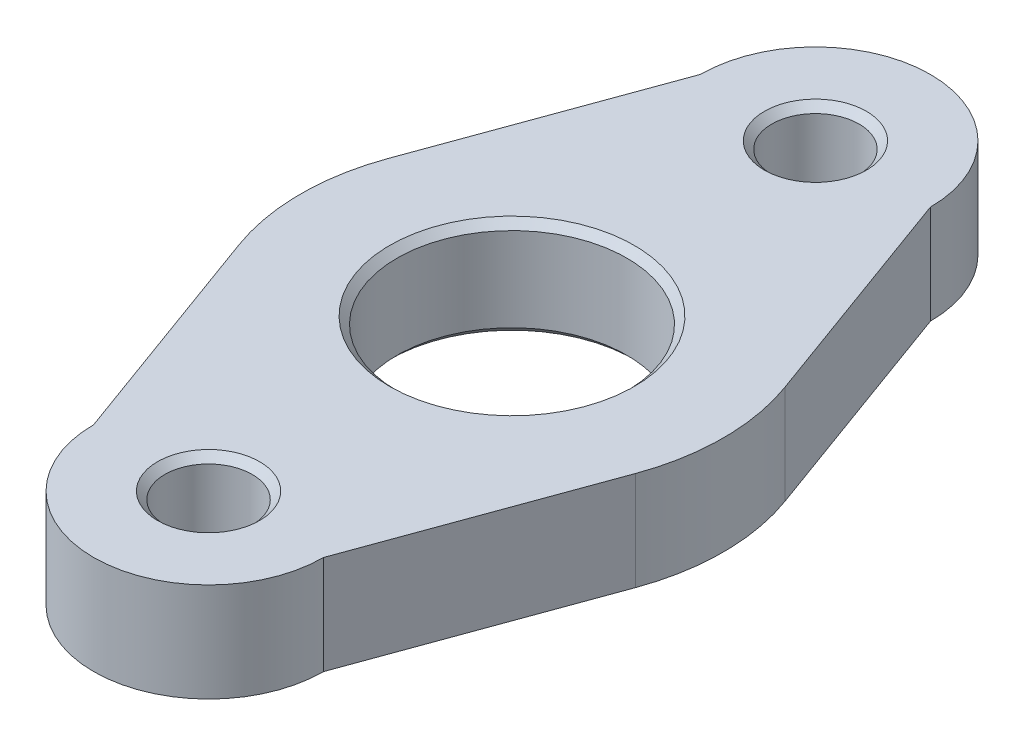
ISO-10303-21;
HEADER;
FILE_DESCRIPTION(('STEP AP214'),'2;1');
FILE_NAME('part.step','',(''),(''),'','','');
FILE_SCHEMA(('AUTOMOTIVE_DESIGN { 1 0 10303 214 1 1 1 1 }'));
ENDSEC;
DATA;
#1=APPLICATION_CONTEXT('core data for automotive mechanical design processes');
#2=APPLICATION_PROTOCOL_DEFINITION('international standard','automotive_design',2000,#1);
#3=PRODUCT_CONTEXT('',#1,'mechanical');
#4=PRODUCT('Part','Part','',(#3));
#5=PRODUCT_RELATED_PRODUCT_CATEGORY('part','',(#4));
#6=PRODUCT_DEFINITION_FORMATION('','',#4);
#7=PRODUCT_DEFINITION_CONTEXT('part definition',#1,'design');
#8=PRODUCT_DEFINITION('design','',#6,#7);
#9=PRODUCT_DEFINITION_SHAPE('','',#8);
#10=(LENGTH_UNIT() NAMED_UNIT(*) SI_UNIT(.MILLI.,.METRE.));
#11=(NAMED_UNIT(*) PLANE_ANGLE_UNIT() SI_UNIT($,.RADIAN.));
#12=(NAMED_UNIT(*) SI_UNIT($,.STERADIAN.) SOLID_ANGLE_UNIT());
#13=UNCERTAINTY_MEASURE_WITH_UNIT(LENGTH_MEASURE(1.E-05),#10,'distance_accuracy_value','');
#14=(GEOMETRIC_REPRESENTATION_CONTEXT(3) GLOBAL_UNCERTAINTY_ASSIGNED_CONTEXT((#13)) GLOBAL_UNIT_ASSIGNED_CONTEXT((#10,
#11,#12)) REPRESENTATION_CONTEXT('',''));
#15=CARTESIAN_POINT('',(0.,0.,0.));
#16=DIRECTION('',(0.,0.,1.));
#17=DIRECTION('',(1.,0.,0.));
#18=AXIS2_PLACEMENT_3D('',#15,#16,#17);
#19=CARTESIAN_POINT('',(95.885,80.772,-33.528));
#20=DIRECTION('',(0.,1.,0.));
#21=DIRECTION('',(0.,0.,1.));
#22=AXIS2_PLACEMENT_3D('',#19,#20,#21);
#23=PLANE('',#22);
#24=CARTESIAN_POINT('',(95.885,80.772,33.528));
#25=DIRECTION('',(0.,1.,0.));
#26=DIRECTION('',(0.,0.,1.));
#27=AXIS2_PLACEMENT_3D('',#24,#25,#26);
#28=CIRCLE('',#27,5.63879999999829);
#29=CARTESIAN_POINT('',(95.885,80.772,39.1667999999983));
#30=VERTEX_POINT('',#29);
#31=EDGE_CURVE('E188',#30,#30,#28,.F.);
#32=ORIENTED_EDGE('',*,*,#31,.T.);
#33=EDGE_LOOP('',(#32));
#34=FACE_BOUND('',#33,.T.);
#35=CARTESIAN_POINT('',(95.885,80.772,-33.528));
#36=DIRECTION('',(0.,1.,0.));
#37=DIRECTION('',(0.,0.,1.));
#38=AXIS2_PLACEMENT_3D('',#35,#36,#37);
#39=CIRCLE('',#38,5.6388);
#40=CARTESIAN_POINT('',(95.885,80.772,-27.8892));
#41=VERTEX_POINT('',#40);
#42=EDGE_CURVE('E185',#41,#41,#39,.F.);
#43=ORIENTED_EDGE('',*,*,#42,.T.);
#44=EDGE_LOOP('',(#43));
#45=FACE_BOUND('',#44,.T.);
#46=CARTESIAN_POINT('',(95.885,80.772,0.));
#47=DIRECTION('',(0.,1.,0.));
#48=DIRECTION('',(0.,0.,1.));
#49=AXIS2_PLACEMENT_3D('',#46,#47,#48);
#50=CIRCLE('',#49,13.5128);
#51=CARTESIAN_POINT('',(95.885,80.772,13.5128));
#52=VERTEX_POINT('',#51);
#53=EDGE_CURVE('E182',#52,#52,#50,.F.);
#54=ORIENTED_EDGE('',*,*,#53,.T.);
#55=EDGE_LOOP('',(#54));
#56=FACE_BOUND('',#55,.T.);
#57=CARTESIAN_POINT('',(95.885,80.772,-33.528));
#58=DIRECTION('',(0.,1.,0.));
#59=DIRECTION('',(0.,0.,1.));
#60=AXIS2_PLACEMENT_3D('',#57,#58,#59);
#61=CIRCLE('',#60,12.7);
#62=CARTESIAN_POINT('',(108.585,80.772,-33.528));
#63=VERTEX_POINT('',#62);
#64=CARTESIAN_POINT('',(83.185,80.772,-33.528));
#65=VERTEX_POINT('',#64);
#66=EDGE_CURVE('E152',#63,#65,#61,.T.);
#67=ORIENTED_EDGE('',*,*,#66,.T.);
#68=DIRECTION('',(-0.342020143325663,0.,0.93969262078591));
#69=VECTOR('',#68,1.);
#70=CARTESIAN_POINT('',(83.185,80.772,-33.528));
#71=LINE('',#70,#69);
#72=CARTESIAN_POINT('',(73.9856326958027,80.772,-8.25294605844833));
#73=VERTEX_POINT('',#72);
#74=EDGE_CURVE('E102',#65,#73,#71,.T.);
#75=ORIENTED_EDGE('',*,*,#74,.T.);
#76=CARTESIAN_POINT('',(96.6604156353667,80.772,0.));
#77=DIRECTION('',(0.,1.,0.));
#78=DIRECTION('',(0.,0.,1.));
#79=AXIS2_PLACEMENT_3D('',#76,#77,#78);
#80=CIRCLE('',#79,24.13);
#81=CARTESIAN_POINT('',(73.9856326958027,80.772,8.25294605844833));
#82=VERTEX_POINT('',#81);
#83=EDGE_CURVE('E292',#73,#82,#80,.T.);
#84=ORIENTED_EDGE('',*,*,#83,.T.);
#85=DIRECTION('',(0.34202014332569,0.,0.9396926207859));
#86=VECTOR('',#85,1.);
#87=CARTESIAN_POINT('',(73.9856326958027,80.772,8.25294605844832));
#88=LINE('',#87,#86);
#89=CARTESIAN_POINT('',(83.1850000000008,80.772,33.528));
#90=VERTEX_POINT('',#89);
#91=EDGE_CURVE('E296',#82,#90,#88,.T.);
#92=ORIENTED_EDGE('',*,*,#91,.T.);
#93=CARTESIAN_POINT('',(95.885,80.772,33.528));
#94=DIRECTION('',(0.,1.,0.));
#95=DIRECTION('',(0.,0.,1.));
#96=AXIS2_PLACEMENT_3D('',#93,#94,#95);
#97=CIRCLE('',#96,12.6999999999992);
#98=CARTESIAN_POINT('',(108.584999999999,80.772,33.528));
#99=VERTEX_POINT('',#98);
#100=EDGE_CURVE('E120',#90,#99,#97,.T.);
#101=ORIENTED_EDGE('',*,*,#100,.T.);
#102=DIRECTION('',(0.342020143325689,0.,-0.939692620785901));
#103=VECTOR('',#102,1.);
#104=CARTESIAN_POINT('',(108.584999999999,80.772,33.528));
#105=LINE('',#104,#103);
#106=CARTESIAN_POINT('',(117.784367304197,80.772,8.25294605844833));
#107=VERTEX_POINT('',#106);
#108=EDGE_CURVE('E115',#99,#107,#105,.T.);
#109=ORIENTED_EDGE('',*,*,#108,.T.);
#110=CARTESIAN_POINT('',(95.1095843646333,80.772,0.));
#111=DIRECTION('',(0.,1.,0.));
#112=DIRECTION('',(0.,0.,1.));
#113=AXIS2_PLACEMENT_3D('',#110,#111,#112);
#114=CIRCLE('',#113,24.13);
#115=CARTESIAN_POINT('',(117.784367304197,80.772,-8.25294605844832));
#116=VERTEX_POINT('',#115);
#117=EDGE_CURVE('E118',#107,#116,#114,.T.);
#118=ORIENTED_EDGE('',*,*,#117,.T.);
#119=DIRECTION('',(-0.342020143325662,0.,-0.939692620785911));
#120=VECTOR('',#119,1.);
#121=CARTESIAN_POINT('',(117.784367304197,80.772,-8.25294605844833));
#122=LINE('',#121,#120);
#123=EDGE_CURVE('E58',#116,#63,#122,.T.);
#124=ORIENTED_EDGE('',*,*,#123,.T.);
#125=EDGE_LOOP('',(#67,#75,#84,#92,#101,#109,#118,#124));
#126=FACE_BOUND('',#125,.T.);
#127=ADVANCED_FACE('F41',(#34,#45,#56,#126),#23,.T.);
#128=CARTESIAN_POINT('',(95.885,69.85,-33.528));
#129=DIRECTION('',(0.,1.,0.));
#130=DIRECTION('',(0.,0.,1.));
#131=AXIS2_PLACEMENT_3D('',#128,#129,#130);
#132=PLANE('',#131);
#133=CARTESIAN_POINT('',(95.885,69.85,33.528));
#134=DIRECTION('',(0.,1.,0.));
#135=DIRECTION('',(0.,0.,1.));
#136=AXIS2_PLACEMENT_3D('',#133,#134,#135);
#137=CIRCLE('',#136,5.63879999999829);
#138=CARTESIAN_POINT('',(95.885,69.85,39.1667999999983));
#139=VERTEX_POINT('',#138);
#140=EDGE_CURVE('E173',#139,#139,#137,.T.);
#141=ORIENTED_EDGE('',*,*,#140,.T.);
#142=EDGE_LOOP('',(#141));
#143=FACE_BOUND('',#142,.T.);
#144=CARTESIAN_POINT('',(95.885,69.85,-33.528));
#145=DIRECTION('',(0.,1.,0.));
#146=DIRECTION('',(0.,0.,1.));
#147=AXIS2_PLACEMENT_3D('',#144,#145,#146);
#148=CIRCLE('',#147,5.63880000000003);
#149=CARTESIAN_POINT('',(95.885,69.85,-39.1668));
#150=VERTEX_POINT('',#149);
#151=EDGE_CURVE('E170',#150,#150,#148,.T.);
#152=ORIENTED_EDGE('',*,*,#151,.T.);
#153=EDGE_LOOP('',(#152));
#154=FACE_BOUND('',#153,.T.);
#155=CARTESIAN_POINT('',(95.885,69.85,0.));
#156=DIRECTION('',(0.,1.,0.));
#157=DIRECTION('',(0.,0.,1.));
#158=AXIS2_PLACEMENT_3D('',#155,#156,#157);
#159=CIRCLE('',#158,13.5128);
#160=CARTESIAN_POINT('',(95.885,69.85,13.5128));
#161=VERTEX_POINT('',#160);
#162=EDGE_CURVE('E167',#161,#161,#159,.T.);
#163=ORIENTED_EDGE('',*,*,#162,.T.);
#164=EDGE_LOOP('',(#163));
#165=FACE_BOUND('',#164,.T.);
#166=CARTESIAN_POINT('',(95.885,69.85,-33.528));
#167=DIRECTION('',(0.,1.,0.));
#168=DIRECTION('',(0.,0.,1.));
#169=AXIS2_PLACEMENT_3D('',#166,#167,#168);
#170=CIRCLE('',#169,12.7);
#171=CARTESIAN_POINT('',(108.585,69.85,-33.528));
#172=VERTEX_POINT('',#171);
#173=CARTESIAN_POINT('',(83.185,69.85,-33.528));
#174=VERTEX_POINT('',#173);
#175=EDGE_CURVE('E138',#172,#174,#170,.T.);
#176=ORIENTED_EDGE('',*,*,#175,.F.);
#177=DIRECTION('',(-0.342020143325662,0.,-0.939692620785911));
#178=VECTOR('',#177,1.);
#179=CARTESIAN_POINT('',(117.784367304197,69.85,-8.25294605844833));
#180=LINE('',#179,#178);
#181=CARTESIAN_POINT('',(117.784367304197,69.85,-8.25294605844832));
#182=VERTEX_POINT('',#181);
#183=EDGE_CURVE('E93',#182,#172,#180,.T.);
#184=ORIENTED_EDGE('',*,*,#183,.F.);
#185=CARTESIAN_POINT('',(95.1095843646333,69.85,0.));
#186=DIRECTION('',(0.,1.,0.));
#187=DIRECTION('',(0.,0.,1.));
#188=AXIS2_PLACEMENT_3D('',#185,#186,#187);
#189=CIRCLE('',#188,24.13);
#190=CARTESIAN_POINT('',(117.784367304197,69.85,8.25294605844833));
#191=VERTEX_POINT('',#190);
#192=EDGE_CURVE('E87',#191,#182,#189,.T.);
#193=ORIENTED_EDGE('',*,*,#192,.F.);
#194=DIRECTION('',(0.342020143325689,0.,-0.939692620785901));
#195=VECTOR('',#194,1.);
#196=CARTESIAN_POINT('',(108.584999999999,69.85,33.528));
#197=LINE('',#196,#195);
#198=CARTESIAN_POINT('',(108.584999999999,69.85,33.528));
#199=VERTEX_POINT('',#198);
#200=EDGE_CURVE('E128',#199,#191,#197,.T.);
#201=ORIENTED_EDGE('',*,*,#200,.F.);
#202=CARTESIAN_POINT('',(95.885,69.85,33.528));
#203=DIRECTION('',(0.,1.,0.));
#204=DIRECTION('',(0.,0.,1.));
#205=AXIS2_PLACEMENT_3D('',#202,#203,#204);
#206=CIRCLE('',#205,12.6999999999992);
#207=CARTESIAN_POINT('',(83.1850000000008,69.85,33.528));
#208=VERTEX_POINT('',#207);
#209=EDGE_CURVE('E147',#208,#199,#206,.T.);
#210=ORIENTED_EDGE('',*,*,#209,.F.);
#211=DIRECTION('',(0.34202014332569,0.,0.9396926207859));
#212=VECTOR('',#211,1.);
#213=CARTESIAN_POINT('',(73.9856326958027,69.85,8.25294605844832));
#214=LINE('',#213,#212);
#215=CARTESIAN_POINT('',(73.9856326958027,69.85,8.25294605844833));
#216=VERTEX_POINT('',#215);
#217=EDGE_CURVE('E145',#216,#208,#214,.T.);
#218=ORIENTED_EDGE('',*,*,#217,.F.);
#219=CARTESIAN_POINT('',(96.6604156353667,69.85,0.));
#220=DIRECTION('',(0.,1.,0.));
#221=DIRECTION('',(0.,0.,1.));
#222=AXIS2_PLACEMENT_3D('',#219,#220,#221);
#223=CIRCLE('',#222,24.13);
#224=CARTESIAN_POINT('',(73.9856326958027,69.85,-8.25294605844833));
#225=VERTEX_POINT('',#224);
#226=EDGE_CURVE('E143',#225,#216,#223,.T.);
#227=ORIENTED_EDGE('',*,*,#226,.F.);
#228=DIRECTION('',(-0.342020143325663,0.,0.93969262078591));
#229=VECTOR('',#228,1.);
#230=CARTESIAN_POINT('',(83.185,69.85,-33.528));
#231=LINE('',#230,#229);
#232=EDGE_CURVE('E141',#174,#225,#231,.T.);
#233=ORIENTED_EDGE('',*,*,#232,.F.);
#234=EDGE_LOOP('',(#176,#184,#193,#201,#210,#218,#227,#233));
#235=FACE_BOUND('',#234,.T.);
#236=ADVANCED_FACE('F211',(#143,#154,#165,#235),#132,.F.);
#237=CARTESIAN_POINT('',(95.885,80.772,-33.528));
#238=DIRECTION('',(0.,-1.,0.));
#239=DIRECTION('',(0.,0.,-1.));
#240=AXIS2_PLACEMENT_3D('',#237,#238,#239);
#241=CYLINDRICAL_SURFACE('',#240,12.7);
#242=ORIENTED_EDGE('',*,*,#175,.T.);
#243=DIRECTION('',(0.,-1.,0.));
#244=VECTOR('',#243,1.);
#245=CARTESIAN_POINT('',(83.185,80.772,-33.528));
#246=LINE('',#245,#244);
#247=EDGE_CURVE('E165',#65,#174,#246,.T.);
#248=ORIENTED_EDGE('',*,*,#247,.F.);
#249=ORIENTED_EDGE('',*,*,#66,.F.);
#250=DIRECTION('',(0.,-1.,0.));
#251=VECTOR('',#250,1.);
#252=CARTESIAN_POINT('',(108.585,80.772,-33.528));
#253=LINE('',#252,#251);
#254=EDGE_CURVE('E134',#63,#172,#253,.T.);
#255=ORIENTED_EDGE('',*,*,#254,.T.);
#256=EDGE_LOOP('',(#242,#248,#249,#255));
#257=FACE_BOUND('',#256,.T.);
#258=ADVANCED_FACE('F217',(#257),#241,.T.);
#259=CARTESIAN_POINT('',(83.185,80.772,-33.528));
#260=DIRECTION('',(0.93969262078591,0.,0.342020143325663));
#261=DIRECTION('',(0.342020143325663,0.,-0.939692620785911));
#262=AXIS2_PLACEMENT_3D('',#259,#260,#261);
#263=PLANE('',#262);
#264=ORIENTED_EDGE('',*,*,#232,.T.);
#265=DIRECTION('',(0.,-1.,0.));
#266=VECTOR('',#265,1.);
#267=CARTESIAN_POINT('',(73.9856326958027,80.772,-8.25294605844833));
#268=LINE('',#267,#266);
#269=EDGE_CURVE('E162',#73,#225,#268,.T.);
#270=ORIENTED_EDGE('',*,*,#269,.F.);
#271=ORIENTED_EDGE('',*,*,#74,.F.);
#272=ORIENTED_EDGE('',*,*,#247,.T.);
#273=EDGE_LOOP('',(#264,#270,#271,#272));
#274=FACE_BOUND('',#273,.T.);
#275=ADVANCED_FACE('F243',(#274),#263,.F.);
#276=CARTESIAN_POINT('',(96.6604156353667,80.772,0.));
#277=DIRECTION('',(0.,-1.,0.));
#278=DIRECTION('',(0.,0.,-1.));
#279=AXIS2_PLACEMENT_3D('',#276,#277,#278);
#280=CYLINDRICAL_SURFACE('',#279,24.13);
#281=ORIENTED_EDGE('',*,*,#226,.T.);
#282=DIRECTION('',(0.,-1.,0.));
#283=VECTOR('',#282,1.);
#284=CARTESIAN_POINT('',(73.9856326958027,80.772,8.25294605844833));
#285=LINE('',#284,#283);
#286=EDGE_CURVE('E159',#82,#216,#285,.T.);
#287=ORIENTED_EDGE('',*,*,#286,.F.);
#288=ORIENTED_EDGE('',*,*,#83,.F.);
#289=ORIENTED_EDGE('',*,*,#269,.T.);
#290=EDGE_LOOP('',(#281,#287,#288,#289));
#291=FACE_BOUND('',#290,.T.);
#292=ADVANCED_FACE('F239',(#291),#280,.T.);
#293=CARTESIAN_POINT('',(73.9856326958027,80.772,8.25294605844832));
#294=DIRECTION('',(0.9396926207859,0.,-0.34202014332569));
#295=DIRECTION('',(-0.34202014332569,0.,-0.939692620785901));
#296=AXIS2_PLACEMENT_3D('',#293,#294,#295);
#297=PLANE('',#296);
#298=ORIENTED_EDGE('',*,*,#217,.T.);
#299=DIRECTION('',(0.,-1.,0.));
#300=VECTOR('',#299,1.);
#301=CARTESIAN_POINT('',(83.1850000000008,80.772,33.528));
#302=LINE('',#301,#300);
#303=EDGE_CURVE('E156',#90,#208,#302,.T.);
#304=ORIENTED_EDGE('',*,*,#303,.F.);
#305=ORIENTED_EDGE('',*,*,#91,.F.);
#306=ORIENTED_EDGE('',*,*,#286,.T.);
#307=EDGE_LOOP('',(#298,#304,#305,#306));
#308=FACE_BOUND('',#307,.T.);
#309=ADVANCED_FACE('F235',(#308),#297,.F.);
#310=CARTESIAN_POINT('',(95.885,80.772,33.528));
#311=DIRECTION('',(0.,-1.,0.));
#312=DIRECTION('',(0.,0.,-1.));
#313=AXIS2_PLACEMENT_3D('',#310,#311,#312);
#314=CYLINDRICAL_SURFACE('',#313,12.6999999999992);
#315=ORIENTED_EDGE('',*,*,#209,.T.);
#316=DIRECTION('',(0.,-1.,0.));
#317=VECTOR('',#316,1.);
#318=CARTESIAN_POINT('',(108.584999999999,80.772,33.528));
#319=LINE('',#318,#317);
#320=EDGE_CURVE('E129',#99,#199,#319,.T.);
#321=ORIENTED_EDGE('',*,*,#320,.F.);
#322=ORIENTED_EDGE('',*,*,#100,.F.);
#323=ORIENTED_EDGE('',*,*,#303,.T.);
#324=EDGE_LOOP('',(#315,#321,#322,#323));
#325=FACE_BOUND('',#324,.T.);
#326=ADVANCED_FACE('F232',(#325),#314,.T.);
#327=CARTESIAN_POINT('',(108.584999999999,80.772,33.528));
#328=DIRECTION('',(-0.939692620785901,0.,-0.342020143325689));
#329=DIRECTION('',(-0.342020143325689,0.,0.939692620785901));
#330=AXIS2_PLACEMENT_3D('',#327,#328,#329);
#331=PLANE('',#330);
#332=ORIENTED_EDGE('',*,*,#200,.T.);
#333=DIRECTION('',(0.,-1.,0.));
#334=VECTOR('',#333,1.);
#335=CARTESIAN_POINT('',(117.784367304197,80.772,8.25294605844833));
#336=LINE('',#335,#334);
#337=EDGE_CURVE('E125',#107,#191,#336,.T.);
#338=ORIENTED_EDGE('',*,*,#337,.F.);
#339=ORIENTED_EDGE('',*,*,#108,.F.);
#340=ORIENTED_EDGE('',*,*,#320,.T.);
#341=EDGE_LOOP('',(#332,#338,#339,#340));
#342=FACE_BOUND('',#341,.T.);
#343=ADVANCED_FACE('F126',(#342),#331,.F.);
#344=CARTESIAN_POINT('',(95.1095843646333,80.772,0.));
#345=DIRECTION('',(0.,-1.,0.));
#346=DIRECTION('',(0.,0.,-1.));
#347=AXIS2_PLACEMENT_3D('',#344,#345,#346);
#348=CYLINDRICAL_SURFACE('',#347,24.13);
#349=ORIENTED_EDGE('',*,*,#192,.T.);
#350=DIRECTION('',(0.,-1.,0.));
#351=VECTOR('',#350,1.);
#352=CARTESIAN_POINT('',(117.784367304197,80.772,-8.25294605844832));
#353=LINE('',#352,#351);
#354=EDGE_CURVE('E130',#116,#182,#353,.T.);
#355=ORIENTED_EDGE('',*,*,#354,.F.);
#356=ORIENTED_EDGE('',*,*,#117,.F.);
#357=ORIENTED_EDGE('',*,*,#337,.T.);
#358=EDGE_LOOP('',(#349,#355,#356,#357));
#359=FACE_BOUND('',#358,.T.);
#360=ADVANCED_FACE('F132',(#359),#348,.T.);
#361=CARTESIAN_POINT('',(117.784367304197,80.772,-8.25294605844833));
#362=DIRECTION('',(-0.939692620785911,0.,0.342020143325662));
#363=DIRECTION('',(0.342020143325662,0.,0.939692620785911));
#364=AXIS2_PLACEMENT_3D('',#361,#362,#363);
#365=PLANE('',#364);
#366=ORIENTED_EDGE('',*,*,#183,.T.);
#367=ORIENTED_EDGE('',*,*,#254,.F.);
#368=ORIENTED_EDGE('',*,*,#123,.F.);
#369=ORIENTED_EDGE('',*,*,#354,.T.);
#370=EDGE_LOOP('',(#366,#367,#368,#369));
#371=FACE_BOUND('',#370,.T.);
#372=ADVANCED_FACE('F225',(#371),#365,.F.);
#373=CARTESIAN_POINT('',(95.885,80.772,33.528));
#374=DIRECTION('',(0.,-1.,0.));
#375=DIRECTION('',(0.,0.,-1.));
#376=AXIS2_PLACEMENT_3D('',#373,#374,#375);
#377=CYLINDRICAL_SURFACE('',#376,4.82599999999831);
#378=CARTESIAN_POINT('',(95.885,70.6628,33.528));
#379=DIRECTION('',(0.,1.,0.));
#380=DIRECTION('',(0.,0.,1.));
#381=AXIS2_PLACEMENT_3D('',#378,#379,#380);
#382=CIRCLE('',#381,4.82599999999831);
#383=CARTESIAN_POINT('',(95.885,70.6628,38.3539999999983));
#384=VERTEX_POINT('',#383);
#385=EDGE_CURVE('E179',#384,#384,#382,.F.);
#386=ORIENTED_EDGE('',*,*,#385,.T.);
#387=EDGE_LOOP('',(#386));
#388=FACE_BOUND('',#387,.T.);
#389=CARTESIAN_POINT('',(95.885,79.9592,33.528));
#390=DIRECTION('',(0.,1.,0.));
#391=DIRECTION('',(0.,0.,1.));
#392=AXIS2_PLACEMENT_3D('',#389,#390,#391);
#393=CIRCLE('',#392,4.82599999999831);
#394=CARTESIAN_POINT('',(95.885,79.9592,38.3539999999983));
#395=VERTEX_POINT('',#394);
#396=EDGE_CURVE('E176',#395,#395,#393,.T.);
#397=ORIENTED_EDGE('',*,*,#396,.T.);
#398=EDGE_LOOP('',(#397));
#399=FACE_BOUND('',#398,.T.);
#400=ADVANCED_FACE('F222',(#388,#399),#377,.F.);
#401=CARTESIAN_POINT('',(95.885,80.772,-33.528));
#402=DIRECTION('',(0.,-1.,0.));
#403=DIRECTION('',(0.,0.,-1.));
#404=AXIS2_PLACEMENT_3D('',#401,#402,#403);
#405=CYLINDRICAL_SURFACE('',#404,4.82599999999999);
#406=CARTESIAN_POINT('',(95.885,70.6628,-33.528));
#407=DIRECTION('',(0.,1.,0.));
#408=DIRECTION('',(0.,0.,1.));
#409=AXIS2_PLACEMENT_3D('',#406,#407,#408);
#410=CIRCLE('',#409,4.82599999999999);
#411=CARTESIAN_POINT('',(95.885,70.6628,-38.354));
#412=VERTEX_POINT('',#411);
#413=EDGE_CURVE('E194',#412,#412,#410,.F.);
#414=ORIENTED_EDGE('',*,*,#413,.T.);
#415=EDGE_LOOP('',(#414));
#416=FACE_BOUND('',#415,.T.);
#417=CARTESIAN_POINT('',(95.885,79.9592,-33.528));
#418=DIRECTION('',(0.,1.,0.));
#419=DIRECTION('',(0.,0.,1.));
#420=AXIS2_PLACEMENT_3D('',#417,#418,#419);
#421=CIRCLE('',#420,4.82599999999999);
#422=CARTESIAN_POINT('',(95.885,79.9592,-28.702));
#423=VERTEX_POINT('',#422);
#424=EDGE_CURVE('E191',#423,#423,#421,.T.);
#425=ORIENTED_EDGE('',*,*,#424,.T.);
#426=EDGE_LOOP('',(#425));
#427=FACE_BOUND('',#426,.T.);
#428=ADVANCED_FACE('F270',(#416,#427),#405,.F.);
#429=CARTESIAN_POINT('',(95.885,80.772,0.));
#430=DIRECTION('',(0.,-1.,0.));
#431=DIRECTION('',(0.,0.,-1.));
#432=AXIS2_PLACEMENT_3D('',#429,#430,#431);
#433=CYLINDRICAL_SURFACE('',#432,12.7);
#434=CARTESIAN_POINT('',(95.885,70.6628,0.));
#435=DIRECTION('',(0.,1.,0.));
#436=DIRECTION('',(0.,0.,1.));
#437=AXIS2_PLACEMENT_3D('',#434,#435,#436);
#438=CIRCLE('',#437,12.7);
#439=CARTESIAN_POINT('',(95.885,70.6628,12.7));
#440=VERTEX_POINT('',#439);
#441=EDGE_CURVE('E11',#440,#440,#438,.F.);
#442=ORIENTED_EDGE('',*,*,#441,.T.);
#443=EDGE_LOOP('',(#442));
#444=FACE_BOUND('',#443,.T.);
#445=CARTESIAN_POINT('',(95.885,79.9592,0.));
#446=DIRECTION('',(0.,1.,0.));
#447=DIRECTION('',(0.,0.,1.));
#448=AXIS2_PLACEMENT_3D('',#445,#446,#447);
#449=CIRCLE('',#448,12.7);
#450=CARTESIAN_POINT('',(95.885,79.9592,12.7));
#451=VERTEX_POINT('',#450);
#452=EDGE_CURVE('E50',#451,#451,#449,.T.);
#453=ORIENTED_EDGE('',*,*,#452,.T.);
#454=EDGE_LOOP('',(#453));
#455=FACE_BOUND('',#454,.T.);
#456=ADVANCED_FACE('F199',(#444,#455),#433,.F.);
#457=CARTESIAN_POINT('',(95.885,69.85,33.528));
#458=DIRECTION('',(0.,-1.,0.));
#459=DIRECTION('',(0.,0.,-1.));
#460=AXIS2_PLACEMENT_3D('',#457,#458,#459);
#461=CONICAL_SURFACE('',#460,5.63879999999829,0.785398163397446);
#462=ORIENTED_EDGE('',*,*,#385,.F.);
#463=EDGE_LOOP('',(#462));
#464=FACE_BOUND('',#463,.T.);
#465=ORIENTED_EDGE('',*,*,#140,.F.);
#466=EDGE_LOOP('',(#465));
#467=FACE_BOUND('',#466,.T.);
#468=ADVANCED_FACE('F250',(#464,#467),#461,.F.);
#469=CARTESIAN_POINT('',(95.885,79.9592,33.528));
#470=DIRECTION('',(0.,1.,0.));
#471=DIRECTION('',(0.,0.,1.));
#472=AXIS2_PLACEMENT_3D('',#469,#470,#471);
#473=CONICAL_SURFACE('',#472,4.82599999999831,0.785398163397438);
#474=ORIENTED_EDGE('',*,*,#31,.F.);
#475=EDGE_LOOP('',(#474));
#476=FACE_BOUND('',#475,.T.);
#477=ORIENTED_EDGE('',*,*,#396,.F.);
#478=EDGE_LOOP('',(#477));
#479=FACE_BOUND('',#478,.T.);
#480=ADVANCED_FACE('F253',(#476,#479),#473,.F.);
#481=CARTESIAN_POINT('',(95.885,69.85,-33.528));
#482=DIRECTION('',(0.,-1.,0.));
#483=DIRECTION('',(0.,0.,-1.));
#484=AXIS2_PLACEMENT_3D('',#481,#482,#483);
#485=CONICAL_SURFACE('',#484,5.63880000000003,0.785398163397453);
#486=CARTESIAN_POINT('',(95.885,70.6628,-38.354));
#487=CARTESIAN_POINT('',(95.885,70.6543333333333,-38.3624666666667));
#488=CARTESIAN_POINT('',(95.885,70.6458666666667,-38.3709333333333));
#489=CARTESIAN_POINT('',(95.885,70.6289333333334,-38.3878666666667));
#490=CARTESIAN_POINT('',(95.885,70.6204666666667,-38.3963333333333));
#491=CARTESIAN_POINT('',(95.885,70.6035333333334,-38.4132666666667));
#492=CARTESIAN_POINT('',(95.885,70.5950666666667,-38.4217333333333));
#493=CARTESIAN_POINT('',(95.885,70.5781333333334,-38.4386666666667));
#494=CARTESIAN_POINT('',(95.885,70.5696666666667,-38.4471333333333));
#495=CARTESIAN_POINT('',(95.885,70.5527333333334,-38.4640666666667));
#496=CARTESIAN_POINT('',(95.885,70.5442666666667,-38.4725333333333));
#497=CARTESIAN_POINT('',(95.885,70.5273333333333,-38.4894666666667));
#498=CARTESIAN_POINT('',(95.885,70.5188666666667,-38.4979333333333));
#499=CARTESIAN_POINT('',(95.885,70.5019333333334,-38.5148666666667));
#500=CARTESIAN_POINT('',(95.885,70.4934666666667,-38.5233333333333));
#501=CARTESIAN_POINT('',(95.885,70.4765333333333,-38.5402666666667));
#502=CARTESIAN_POINT('',(95.885,70.4680666666667,-38.5487333333333));
#503=CARTESIAN_POINT('',(95.885,70.4511333333333,-38.5656666666667));
#504=CARTESIAN_POINT('',(95.885,70.4426666666667,-38.5741333333333));
#505=CARTESIAN_POINT('',(95.885,70.4257333333334,-38.5910666666667));
#506=CARTESIAN_POINT('',(95.885,70.4172666666667,-38.5995333333333));
#507=CARTESIAN_POINT('',(95.885,70.4003333333333,-38.6164666666667));
#508=CARTESIAN_POINT('',(95.885,70.3918666666667,-38.6249333333333));
#509=CARTESIAN_POINT('',(95.885,70.3749333333333,-38.6418666666667));
#510=CARTESIAN_POINT('',(95.885,70.3664666666667,-38.6503333333333));
#511=CARTESIAN_POINT('',(95.885,70.3495333333333,-38.6672666666667));
#512=CARTESIAN_POINT('',(95.885,70.3410666666667,-38.6757333333333));
#513=CARTESIAN_POINT('',(95.885,70.3241333333334,-38.6926666666667));
#514=CARTESIAN_POINT('',(95.885,70.3156666666667,-38.7011333333333));
#515=CARTESIAN_POINT('',(95.885,70.2987333333333,-38.7180666666667));
#516=CARTESIAN_POINT('',(95.885,70.2902666666667,-38.7265333333334));
#517=CARTESIAN_POINT('',(95.885,70.2733333333333,-38.7434666666667));
#518=CARTESIAN_POINT('',(95.885,70.2648666666667,-38.7519333333333));
#519=CARTESIAN_POINT('',(95.885,70.2479333333333,-38.7688666666667));
#520=CARTESIAN_POINT('',(95.885,70.2394666666667,-38.7773333333334));
#521=CARTESIAN_POINT('',(95.885,70.2225333333333,-38.7942666666667));
#522=CARTESIAN_POINT('',(95.885,70.2140666666667,-38.8027333333334));
#523=CARTESIAN_POINT('',(95.885,70.1971333333333,-38.8196666666667));
#524=CARTESIAN_POINT('',(95.885,70.1886666666667,-38.8281333333333));
#525=CARTESIAN_POINT('',(95.885,70.1717333333333,-38.8450666666667));
#526=CARTESIAN_POINT('',(95.885,70.1632666666667,-38.8535333333334));
#527=CARTESIAN_POINT('',(95.885,70.1463333333333,-38.8704666666667));
#528=CARTESIAN_POINT('',(95.885,70.1378666666667,-38.8789333333334));
#529=CARTESIAN_POINT('',(95.885,70.1209333333333,-38.8958666666667));
#530=CARTESIAN_POINT('',(95.885,70.1124666666667,-38.9043333333334));
#531=CARTESIAN_POINT('',(95.885,70.0955333333333,-38.9212666666667));
#532=CARTESIAN_POINT('',(95.885,70.0870666666667,-38.9297333333334));
#533=CARTESIAN_POINT('',(95.885,70.0701333333333,-38.9466666666667));
#534=CARTESIAN_POINT('',(95.885,70.0616666666667,-38.9551333333334));
#535=CARTESIAN_POINT('',(95.885,70.0447333333333,-38.9720666666667));
#536=CARTESIAN_POINT('',(95.885,70.0362666666667,-38.9805333333334));
#537=CARTESIAN_POINT('',(95.885,70.0193333333333,-38.9974666666667));
#538=CARTESIAN_POINT('',(95.885,70.0108666666667,-39.0059333333334));
#539=CARTESIAN_POINT('',(95.885,69.9939333333333,-39.0228666666667));
#540=CARTESIAN_POINT('',(95.885,69.9854666666667,-39.0313333333334));
#541=CARTESIAN_POINT('',(95.885,69.9685333333333,-39.0482666666667));
#542=CARTESIAN_POINT('',(95.885,69.9600666666666,-39.0567333333334));
#543=CARTESIAN_POINT('',(95.885,69.9431333333333,-39.0736666666667));
#544=CARTESIAN_POINT('',(95.885,69.9346666666667,-39.0821333333334));
#545=CARTESIAN_POINT('',(95.885,69.9177333333333,-39.0990666666667));
#546=CARTESIAN_POINT('',(95.885,69.9092666666667,-39.1075333333334));
#547=CARTESIAN_POINT('',(95.885,69.8923333333333,-39.1244666666667));
#548=CARTESIAN_POINT('',(95.885,69.8838666666666,-39.1329333333334));
#549=CARTESIAN_POINT('',(95.885,69.8669333333333,-39.1498666666667));
#550=CARTESIAN_POINT('',(95.885,69.8584666666667,-39.1583333333334));
#551=CARTESIAN_POINT('',(95.885,69.85,-39.1668));
#552=B_SPLINE_CURVE_WITH_KNOTS('',3,(#486,#487,#488,#489,#490,#491,#492,#493,#494,#495,#496,
#497,#498,#499,#500,#501,#502,#503,#504,#505,#506,#507,#508,#509,#510,#511,#512,#513,#514,#515,
#516,#517,#518,#519,#520,#521,#522,#523,#524,#525,#526,#527,#528,#529,#530,#531,#532,#533,#534,
#535,#536,#537,#538,#539,#540,#541,#542,#543,#544,#545,#546,#547,#548,#549,#550,#551),
.UNSPECIFIED.,.F.,.F.,(4,2,2,2,2,2,2,2,2,2,2,2,2,2,2,2,2,2,2,2,2,2,2,2,2,2,2,2,2,2,2,2,4),(0.,
0.0359210244842743,0.0718420489685485,0.107763073452833,0.143684097937107,0.179605122421386,
0.21552614690566,0.251447171389944,0.287368195874219,0.323289220358493,0.359210244842777,
0.395131269327051,0.431052293811335,0.46697331829561,0.502894342779894,0.538815367264168,
0.574736391748447,0.610657416232721,0.646578440716996,0.68249946520128,0.718420489685554,
0.754341514169838,0.790262538654112,0.826183563138397,0.862104587622671,0.898025612106945,
0.933946636591229,0.969867661075499,1.00578868555978,1.04170971004406,1.07763073452834,
1.11355175901262,1.14947278349689),.UNSPECIFIED.);
#553=EDGE_CURVE('BSEAM257',#412,#150,#552,.T.);
#554=ORIENTED_EDGE('',*,*,#413,.F.);
#555=ORIENTED_EDGE('',*,*,#151,.F.);
#556=ORIENTED_EDGE('',*,*,#553,.T.);
#557=ORIENTED_EDGE('',*,*,#553,.F.);
#558=EDGE_LOOP('',(#554,#556,#555,#557));
#559=FACE_BOUND('',#558,.T.);
#560=ADVANCED_FACE('F257',(#559),#485,.F.);
#561=CARTESIAN_POINT('',(95.885,79.9592,-33.528));
#562=DIRECTION('',(0.,1.,0.));
#563=DIRECTION('',(0.,0.,1.));
#564=AXIS2_PLACEMENT_3D('',#561,#562,#563);
#565=CONICAL_SURFACE('',#564,4.82599999999999,0.785398163397453);
#566=ORIENTED_EDGE('',*,*,#42,.F.);
#567=EDGE_LOOP('',(#566));
#568=FACE_BOUND('',#567,.T.);
#569=ORIENTED_EDGE('',*,*,#424,.F.);
#570=EDGE_LOOP('',(#569));
#571=FACE_BOUND('',#570,.T.);
#572=ADVANCED_FACE('F207',(#568,#571),#565,.F.);
#573=CARTESIAN_POINT('',(95.885,69.85,0.));
#574=DIRECTION('',(0.,-1.,0.));
#575=DIRECTION('',(0.,0.,-1.));
#576=AXIS2_PLACEMENT_3D('',#573,#574,#575);
#577=CONICAL_SURFACE('',#576,13.5128,0.785398163397446);
#578=ORIENTED_EDGE('',*,*,#441,.F.);
#579=EDGE_LOOP('',(#578));
#580=FACE_BOUND('',#579,.T.);
#581=ORIENTED_EDGE('',*,*,#162,.F.);
#582=EDGE_LOOP('',(#581));
#583=FACE_BOUND('',#582,.T.);
#584=ADVANCED_FACE('F202',(#580,#583),#577,.F.);
#585=CARTESIAN_POINT('',(95.885,79.9592,0.));
#586=DIRECTION('',(0.,1.,0.));
#587=DIRECTION('',(0.,0.,1.));
#588=AXIS2_PLACEMENT_3D('',#585,#586,#587);
#589=CONICAL_SURFACE('',#588,12.7,0.785398163397448);
#590=ORIENTED_EDGE('',*,*,#53,.F.);
#591=EDGE_LOOP('',(#590));
#592=FACE_BOUND('',#591,.T.);
#593=ORIENTED_EDGE('',*,*,#452,.F.);
#594=EDGE_LOOP('',(#593));
#595=FACE_BOUND('',#594,.T.);
#596=ADVANCED_FACE('F43',(#592,#595),#589,.F.);
#597=CLOSED_SHELL('',(#127,#236,#258,#275,#292,#309,#326,#343,#360,#372,#400,#428,#456,#468,
#480,#560,#572,#584,#596));
#598=MANIFOLD_SOLID_BREP('B2',#597);
#599=ADVANCED_BREP_SHAPE_REPRESENTATION('',(#18,#598),#14);
#600=SHAPE_DEFINITION_REPRESENTATION(#9,#599);
ENDSEC;
END-ISO-10303-21;
